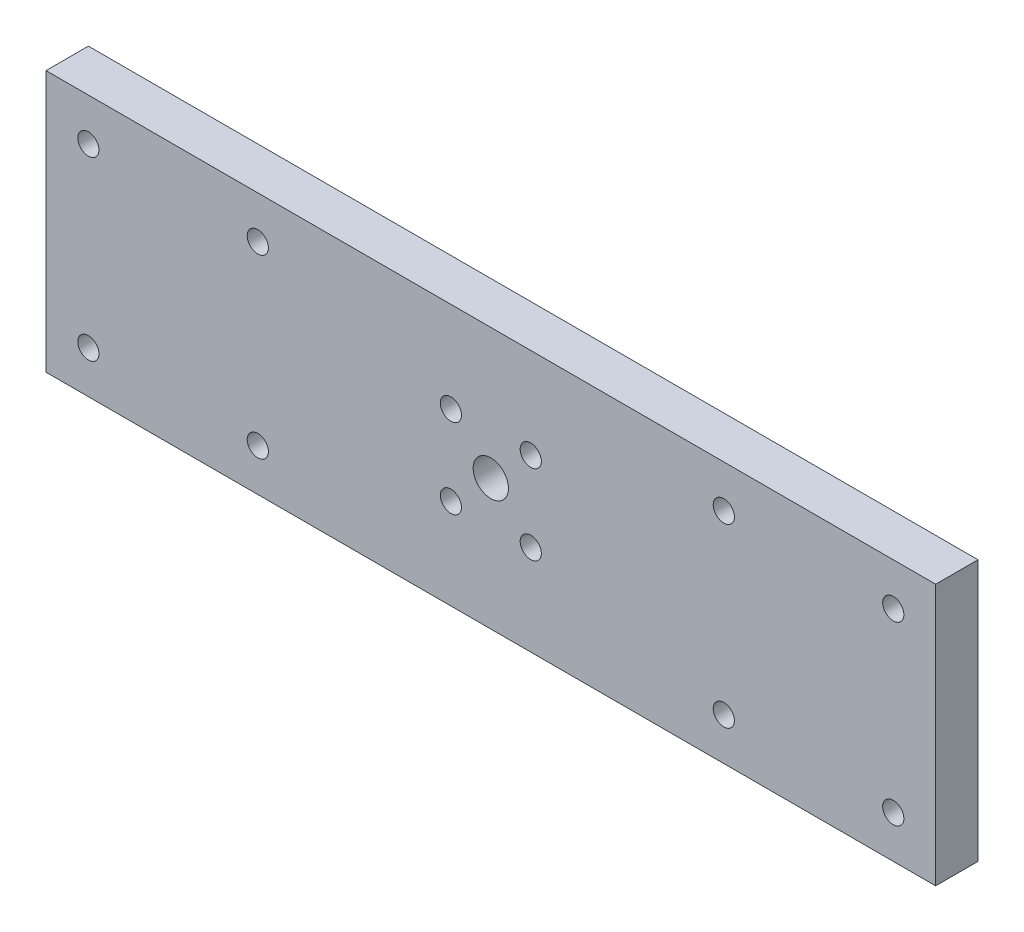
ISO-10303-21;
HEADER;
FILE_DESCRIPTION(('STEP AP214'),'2;1');
FILE_NAME('part.step','',(''),(''),'','','');
FILE_SCHEMA(('AUTOMOTIVE_DESIGN { 1 0 10303 214 1 1 1 1 }'));
ENDSEC;
DATA;
#1=APPLICATION_CONTEXT('core data for automotive mechanical design processes');
#2=APPLICATION_PROTOCOL_DEFINITION('international standard','automotive_design',2000,#1);
#3=PRODUCT_CONTEXT('',#1,'mechanical');
#4=PRODUCT('Part','Part','',(#3));
#5=PRODUCT_RELATED_PRODUCT_CATEGORY('part','',(#4));
#6=PRODUCT_DEFINITION_FORMATION('','',#4);
#7=PRODUCT_DEFINITION_CONTEXT('part definition',#1,'design');
#8=PRODUCT_DEFINITION('design','',#6,#7);
#9=PRODUCT_DEFINITION_SHAPE('','',#8);
#10=(LENGTH_UNIT() NAMED_UNIT(*) SI_UNIT(.MILLI.,.METRE.));
#11=(NAMED_UNIT(*) PLANE_ANGLE_UNIT() SI_UNIT($,.RADIAN.));
#12=(NAMED_UNIT(*) SI_UNIT($,.STERADIAN.) SOLID_ANGLE_UNIT());
#13=UNCERTAINTY_MEASURE_WITH_UNIT(LENGTH_MEASURE(1.E-05),#10,'distance_accuracy_value','');
#14=(GEOMETRIC_REPRESENTATION_CONTEXT(3) GLOBAL_UNCERTAINTY_ASSIGNED_CONTEXT((#13)) GLOBAL_UNIT_ASSIGNED_CONTEXT((#10,
#11,#12)) REPRESENTATION_CONTEXT('',''));
#15=CARTESIAN_POINT('',(0.,0.,0.));
#16=DIRECTION('',(0.,0.,1.));
#17=DIRECTION('',(1.,0.,0.));
#18=AXIS2_PLACEMENT_3D('',#15,#16,#17);
#19=CARTESIAN_POINT('',(63.,0.,6.));
#20=DIRECTION('',(1.,0.,0.));
#21=DIRECTION('',(0.,0.,-1.));
#22=AXIS2_PLACEMENT_3D('',#19,#20,#21);
#23=PLANE('',#22);
#24=DIRECTION('',(0.,-1.,0.));
#25=VECTOR('',#24,1.);
#26=CARTESIAN_POINT('',(63.,0.,0.));
#27=LINE('',#26,#25);
#28=CARTESIAN_POINT('',(63.,18.5,0.));
#29=VERTEX_POINT('',#28);
#30=CARTESIAN_POINT('',(63.,-18.5,0.));
#31=VERTEX_POINT('',#30);
#32=EDGE_CURVE('E146',#29,#31,#27,.T.);
#33=ORIENTED_EDGE('',*,*,#32,.F.);
#34=DIRECTION('',(0.,0.,-1.));
#35=VECTOR('',#34,1.);
#36=CARTESIAN_POINT('',(63.,18.5,6.));
#37=LINE('',#36,#35);
#38=CARTESIAN_POINT('',(63.,18.5,6.));
#39=VERTEX_POINT('',#38);
#40=EDGE_CURVE('E11',#39,#29,#37,.T.);
#41=ORIENTED_EDGE('',*,*,#40,.F.);
#42=DIRECTION('',(0.,-1.,0.));
#43=VECTOR('',#42,1.);
#44=CARTESIAN_POINT('',(63.,0.,6.));
#45=LINE('',#44,#43);
#46=CARTESIAN_POINT('',(63.,-18.5,6.));
#47=VERTEX_POINT('',#46);
#48=EDGE_CURVE('E100',#39,#47,#45,.T.);
#49=ORIENTED_EDGE('',*,*,#48,.T.);
#50=DIRECTION('',(0.,0.,-1.));
#51=VECTOR('',#50,1.);
#52=CARTESIAN_POINT('',(63.,-18.5,6.));
#53=LINE('',#52,#51);
#54=EDGE_CURVE('E78',#47,#31,#53,.T.);
#55=ORIENTED_EDGE('',*,*,#54,.T.);
#56=EDGE_LOOP('',(#33,#41,#49,#55));
#57=FACE_BOUND('',#56,.T.);
#58=ADVANCED_FACE('F38',(#57),#23,.T.);
#59=CARTESIAN_POINT('',(0.,18.5,6.));
#60=DIRECTION('',(0.,1.,0.));
#61=DIRECTION('',(0.,0.,1.));
#62=AXIS2_PLACEMENT_3D('',#59,#60,#61);
#63=PLANE('',#62);
#64=DIRECTION('',(1.,0.,0.));
#65=VECTOR('',#64,1.);
#66=CARTESIAN_POINT('',(0.,18.5,0.));
#67=LINE('',#66,#65);
#68=CARTESIAN_POINT('',(-63.,18.5,0.));
#69=VERTEX_POINT('',#68);
#70=EDGE_CURVE('E90',#69,#29,#67,.T.);
#71=ORIENTED_EDGE('',*,*,#70,.F.);
#72=DIRECTION('',(0.,0.,-1.));
#73=VECTOR('',#72,1.);
#74=CARTESIAN_POINT('',(-63.,18.5,6.));
#75=LINE('',#74,#73);
#76=CARTESIAN_POINT('',(-63.,18.5,6.));
#77=VERTEX_POINT('',#76);
#78=EDGE_CURVE('E47',#77,#69,#75,.T.);
#79=ORIENTED_EDGE('',*,*,#78,.F.);
#80=DIRECTION('',(1.,0.,0.));
#81=VECTOR('',#80,1.);
#82=CARTESIAN_POINT('',(0.,18.5,6.));
#83=LINE('',#82,#81);
#84=EDGE_CURVE('E88',#77,#39,#83,.T.);
#85=ORIENTED_EDGE('',*,*,#84,.T.);
#86=ORIENTED_EDGE('',*,*,#40,.T.);
#87=EDGE_LOOP('',(#71,#79,#85,#86));
#88=FACE_BOUND('',#87,.T.);
#89=ADVANCED_FACE('F86',(#88),#63,.T.);
#90=CARTESIAN_POINT('',(-63.,0.,6.));
#91=DIRECTION('',(1.,0.,0.));
#92=DIRECTION('',(0.,0.,-1.));
#93=AXIS2_PLACEMENT_3D('',#90,#91,#92);
#94=PLANE('',#93);
#95=DIRECTION('',(0.,-1.,0.));
#96=VECTOR('',#95,1.);
#97=CARTESIAN_POINT('',(-63.,0.,0.));
#98=LINE('',#97,#96);
#99=CARTESIAN_POINT('',(-63.,-18.5,0.));
#100=VERTEX_POINT('',#99);
#101=EDGE_CURVE('E149',#69,#100,#98,.T.);
#102=ORIENTED_EDGE('',*,*,#101,.T.);
#103=DIRECTION('',(0.,0.,-1.));
#104=VECTOR('',#103,1.);
#105=CARTESIAN_POINT('',(-63.,-18.5,6.));
#106=LINE('',#105,#104);
#107=CARTESIAN_POINT('',(-63.,-18.5,6.));
#108=VERTEX_POINT('',#107);
#109=EDGE_CURVE('E93',#108,#100,#106,.T.);
#110=ORIENTED_EDGE('',*,*,#109,.F.);
#111=DIRECTION('',(0.,-1.,0.));
#112=VECTOR('',#111,1.);
#113=CARTESIAN_POINT('',(-63.,0.,6.));
#114=LINE('',#113,#112);
#115=EDGE_CURVE('E95',#77,#108,#114,.T.);
#116=ORIENTED_EDGE('',*,*,#115,.F.);
#117=ORIENTED_EDGE('',*,*,#78,.T.);
#118=EDGE_LOOP('',(#102,#110,#116,#117));
#119=FACE_BOUND('',#118,.T.);
#120=ADVANCED_FACE('F96',(#119),#94,.F.);
#121=CARTESIAN_POINT('',(5.65685424949239,5.65685424949238,6.));
#122=DIRECTION('',(0.,0.,-1.));
#123=DIRECTION('',(-1.,0.,0.));
#124=AXIS2_PLACEMENT_3D('',#121,#122,#123);
#125=CYLINDRICAL_SURFACE('',#124,1.5);
#126=CARTESIAN_POINT('',(5.65685424949239,5.65685424949238,6.));
#127=DIRECTION('',(0.,0.,1.));
#128=DIRECTION('',(1.,0.,0.));
#129=AXIS2_PLACEMENT_3D('',#126,#127,#128);
#130=CIRCLE('',#129,1.5);
#131=CARTESIAN_POINT('',(7.15685424949239,5.65685424949238,6.));
#132=VERTEX_POINT('',#131);
#133=EDGE_CURVE('E107',#132,#132,#130,.T.);
#134=ORIENTED_EDGE('',*,*,#133,.T.);
#135=EDGE_LOOP('',(#134));
#136=FACE_BOUND('',#135,.T.);
#137=CARTESIAN_POINT('',(5.65685424949239,5.65685424949238,0.));
#138=DIRECTION('',(0.,0.,1.));
#139=DIRECTION('',(1.,0.,0.));
#140=AXIS2_PLACEMENT_3D('',#137,#138,#139);
#141=CIRCLE('',#140,1.5);
#142=CARTESIAN_POINT('',(7.15685424949239,5.65685424949238,0.));
#143=VERTEX_POINT('',#142);
#144=EDGE_CURVE('E152',#143,#143,#141,.T.);
#145=ORIENTED_EDGE('',*,*,#144,.F.);
#146=EDGE_LOOP('',(#145));
#147=FACE_BOUND('',#146,.T.);
#148=ADVANCED_FACE('F260',(#136,#147),#125,.F.);
#149=CARTESIAN_POINT('',(0.,-18.5,6.));
#150=DIRECTION('',(0.,1.,0.));
#151=DIRECTION('',(0.,0.,1.));
#152=AXIS2_PLACEMENT_3D('',#149,#150,#151);
#153=PLANE('',#152);
#154=DIRECTION('',(1.,0.,0.));
#155=VECTOR('',#154,1.);
#156=CARTESIAN_POINT('',(0.,-18.5,0.));
#157=LINE('',#156,#155);
#158=EDGE_CURVE('E71',#100,#31,#157,.T.);
#159=ORIENTED_EDGE('',*,*,#158,.T.);
#160=ORIENTED_EDGE('',*,*,#54,.F.);
#161=DIRECTION('',(1.,0.,0.));
#162=VECTOR('',#161,1.);
#163=CARTESIAN_POINT('',(0.,-18.5,6.));
#164=LINE('',#163,#162);
#165=EDGE_CURVE('E55',#108,#47,#164,.T.);
#166=ORIENTED_EDGE('',*,*,#165,.F.);
#167=ORIENTED_EDGE('',*,*,#109,.T.);
#168=EDGE_LOOP('',(#159,#160,#166,#167));
#169=FACE_BOUND('',#168,.T.);
#170=ADVANCED_FACE('F161',(#169),#153,.F.);
#171=CARTESIAN_POINT('',(-57.,12.5,6.));
#172=DIRECTION('',(0.,0.,-1.));
#173=DIRECTION('',(-1.,0.,0.));
#174=AXIS2_PLACEMENT_3D('',#171,#172,#173);
#175=CYLINDRICAL_SURFACE('',#174,1.5);
#176=CARTESIAN_POINT('',(-57.,12.5,6.));
#177=DIRECTION('',(0.,0.,1.));
#178=DIRECTION('',(1.,0.,0.));
#179=AXIS2_PLACEMENT_3D('',#176,#177,#178);
#180=CIRCLE('',#179,1.5);
#181=CARTESIAN_POINT('',(-55.5,12.5,6.));
#182=VERTEX_POINT('',#181);
#183=EDGE_CURVE('E102',#182,#182,#180,.T.);
#184=ORIENTED_EDGE('',*,*,#183,.T.);
#185=EDGE_LOOP('',(#184));
#186=FACE_BOUND('',#185,.T.);
#187=CARTESIAN_POINT('',(-57.,12.5,0.));
#188=DIRECTION('',(0.,0.,1.));
#189=DIRECTION('',(1.,0.,0.));
#190=AXIS2_PLACEMENT_3D('',#187,#188,#189);
#191=CIRCLE('',#190,1.5);
#192=CARTESIAN_POINT('',(-55.5,12.5,0.));
#193=VERTEX_POINT('',#192);
#194=EDGE_CURVE('E143',#193,#193,#191,.T.);
#195=ORIENTED_EDGE('',*,*,#194,.F.);
#196=EDGE_LOOP('',(#195));
#197=FACE_BOUND('',#196,.T.);
#198=ADVANCED_FACE('F172',(#186,#197),#175,.F.);
#199=CARTESIAN_POINT('',(33.,12.5,6.));
#200=DIRECTION('',(0.,0.,-1.));
#201=DIRECTION('',(-1.,0.,0.));
#202=AXIS2_PLACEMENT_3D('',#199,#200,#201);
#203=CYLINDRICAL_SURFACE('',#202,1.5);
#204=CARTESIAN_POINT('',(33.,12.5,6.));
#205=DIRECTION('',(0.,0.,1.));
#206=DIRECTION('',(1.,0.,0.));
#207=AXIS2_PLACEMENT_3D('',#204,#205,#206);
#208=CIRCLE('',#207,1.5);
#209=CARTESIAN_POINT('',(34.5,12.5,6.));
#210=VERTEX_POINT('',#209);
#211=EDGE_CURVE('E443',#210,#210,#208,.T.);
#212=ORIENTED_EDGE('',*,*,#211,.T.);
#213=EDGE_LOOP('',(#212));
#214=FACE_BOUND('',#213,.T.);
#215=CARTESIAN_POINT('',(33.,12.5,0.));
#216=DIRECTION('',(0.,0.,1.));
#217=DIRECTION('',(1.,0.,0.));
#218=AXIS2_PLACEMENT_3D('',#215,#216,#217);
#219=CIRCLE('',#218,1.5);
#220=CARTESIAN_POINT('',(34.5,12.5,0.));
#221=VERTEX_POINT('',#220);
#222=EDGE_CURVE('E140',#221,#221,#219,.T.);
#223=ORIENTED_EDGE('',*,*,#222,.F.);
#224=EDGE_LOOP('',(#223));
#225=FACE_BOUND('',#224,.T.);
#226=ADVANCED_FACE('F175',(#214,#225),#203,.F.);
#227=CARTESIAN_POINT('',(-33.,12.5,6.));
#228=DIRECTION('',(0.,0.,-1.));
#229=DIRECTION('',(-1.,0.,0.));
#230=AXIS2_PLACEMENT_3D('',#227,#228,#229);
#231=CYLINDRICAL_SURFACE('',#230,1.5);
#232=CARTESIAN_POINT('',(-33.,12.5,6.));
#233=DIRECTION('',(0.,0.,1.));
#234=DIRECTION('',(1.,0.,0.));
#235=AXIS2_PLACEMENT_3D('',#232,#233,#234);
#236=CIRCLE('',#235,1.5);
#237=CARTESIAN_POINT('',(-31.5,12.5,6.));
#238=VERTEX_POINT('',#237);
#239=EDGE_CURVE('E439',#238,#238,#236,.T.);
#240=ORIENTED_EDGE('',*,*,#239,.T.);
#241=EDGE_LOOP('',(#240));
#242=FACE_BOUND('',#241,.T.);
#243=CARTESIAN_POINT('',(-33.,12.5,0.));
#244=DIRECTION('',(0.,0.,1.));
#245=DIRECTION('',(1.,0.,0.));
#246=AXIS2_PLACEMENT_3D('',#243,#244,#245);
#247=CIRCLE('',#246,1.5);
#248=CARTESIAN_POINT('',(-31.5,12.5,0.));
#249=VERTEX_POINT('',#248);
#250=EDGE_CURVE('E137',#249,#249,#247,.T.);
#251=ORIENTED_EDGE('',*,*,#250,.F.);
#252=EDGE_LOOP('',(#251));
#253=FACE_BOUND('',#252,.T.);
#254=ADVANCED_FACE('F179',(#242,#253),#231,.F.);
#255=CARTESIAN_POINT('',(-57.,-12.5,6.));
#256=DIRECTION('',(0.,0.,-1.));
#257=DIRECTION('',(-1.,0.,0.));
#258=AXIS2_PLACEMENT_3D('',#255,#256,#257);
#259=CYLINDRICAL_SURFACE('',#258,1.5);
#260=CARTESIAN_POINT('',(-57.,-12.5,6.));
#261=DIRECTION('',(0.,0.,1.));
#262=DIRECTION('',(1.,0.,0.));
#263=AXIS2_PLACEMENT_3D('',#260,#261,#262);
#264=CIRCLE('',#263,1.5);
#265=CARTESIAN_POINT('',(-55.5,-12.5,6.));
#266=VERTEX_POINT('',#265);
#267=EDGE_CURVE('E435',#266,#266,#264,.T.);
#268=ORIENTED_EDGE('',*,*,#267,.T.);
#269=EDGE_LOOP('',(#268));
#270=FACE_BOUND('',#269,.T.);
#271=CARTESIAN_POINT('',(-57.,-12.5,0.));
#272=DIRECTION('',(0.,0.,1.));
#273=DIRECTION('',(1.,0.,0.));
#274=AXIS2_PLACEMENT_3D('',#271,#272,#273);
#275=CIRCLE('',#274,1.5);
#276=CARTESIAN_POINT('',(-55.5,-12.5,0.));
#277=VERTEX_POINT('',#276);
#278=EDGE_CURVE('E134',#277,#277,#275,.T.);
#279=ORIENTED_EDGE('',*,*,#278,.F.);
#280=EDGE_LOOP('',(#279));
#281=FACE_BOUND('',#280,.T.);
#282=ADVANCED_FACE('F183',(#270,#281),#259,.F.);
#283=CARTESIAN_POINT('',(-33.,-12.5,6.));
#284=DIRECTION('',(0.,0.,-1.));
#285=DIRECTION('',(-1.,0.,0.));
#286=AXIS2_PLACEMENT_3D('',#283,#284,#285);
#287=CYLINDRICAL_SURFACE('',#286,1.5);
#288=CARTESIAN_POINT('',(-33.,-12.5,6.));
#289=DIRECTION('',(0.,0.,1.));
#290=DIRECTION('',(1.,0.,0.));
#291=AXIS2_PLACEMENT_3D('',#288,#289,#290);
#292=CIRCLE('',#291,1.5);
#293=CARTESIAN_POINT('',(-31.5,-12.5,6.));
#294=VERTEX_POINT('',#293);
#295=EDGE_CURVE('E431',#294,#294,#292,.T.);
#296=ORIENTED_EDGE('',*,*,#295,.T.);
#297=EDGE_LOOP('',(#296));
#298=FACE_BOUND('',#297,.T.);
#299=CARTESIAN_POINT('',(-33.,-12.5,0.));
#300=DIRECTION('',(0.,0.,1.));
#301=DIRECTION('',(1.,0.,0.));
#302=AXIS2_PLACEMENT_3D('',#299,#300,#301);
#303=CIRCLE('',#302,1.5);
#304=CARTESIAN_POINT('',(-31.5,-12.5,0.));
#305=VERTEX_POINT('',#304);
#306=EDGE_CURVE('E131',#305,#305,#303,.T.);
#307=ORIENTED_EDGE('',*,*,#306,.F.);
#308=EDGE_LOOP('',(#307));
#309=FACE_BOUND('',#308,.T.);
#310=ADVANCED_FACE('F187',(#298,#309),#287,.F.);
#311=CARTESIAN_POINT('',(57.,-12.5,6.));
#312=DIRECTION('',(0.,0.,-1.));
#313=DIRECTION('',(-1.,0.,0.));
#314=AXIS2_PLACEMENT_3D('',#311,#312,#313);
#315=CYLINDRICAL_SURFACE('',#314,1.5);
#316=CARTESIAN_POINT('',(57.,-12.5,6.));
#317=DIRECTION('',(0.,0.,1.));
#318=DIRECTION('',(1.,0.,0.));
#319=AXIS2_PLACEMENT_3D('',#316,#317,#318);
#320=CIRCLE('',#319,1.5);
#321=CARTESIAN_POINT('',(58.5,-12.5,6.));
#322=VERTEX_POINT('',#321);
#323=EDGE_CURVE('E427',#322,#322,#320,.T.);
#324=ORIENTED_EDGE('',*,*,#323,.T.);
#325=EDGE_LOOP('',(#324));
#326=FACE_BOUND('',#325,.T.);
#327=CARTESIAN_POINT('',(57.,-12.5,0.));
#328=DIRECTION('',(0.,0.,1.));
#329=DIRECTION('',(1.,0.,0.));
#330=AXIS2_PLACEMENT_3D('',#327,#328,#329);
#331=CIRCLE('',#330,1.5);
#332=CARTESIAN_POINT('',(58.5,-12.5,0.));
#333=VERTEX_POINT('',#332);
#334=EDGE_CURVE('E128',#333,#333,#331,.T.);
#335=ORIENTED_EDGE('',*,*,#334,.F.);
#336=EDGE_LOOP('',(#335));
#337=FACE_BOUND('',#336,.T.);
#338=ADVANCED_FACE('F191',(#326,#337),#315,.F.);
#339=CARTESIAN_POINT('',(57.,12.5,6.));
#340=DIRECTION('',(0.,0.,-1.));
#341=DIRECTION('',(-1.,0.,0.));
#342=AXIS2_PLACEMENT_3D('',#339,#340,#341);
#343=CYLINDRICAL_SURFACE('',#342,1.5);
#344=CARTESIAN_POINT('',(57.,12.5,6.));
#345=DIRECTION('',(0.,0.,1.));
#346=DIRECTION('',(1.,0.,0.));
#347=AXIS2_PLACEMENT_3D('',#344,#345,#346);
#348=CIRCLE('',#347,1.5);
#349=CARTESIAN_POINT('',(58.5,12.5,6.));
#350=VERTEX_POINT('',#349);
#351=EDGE_CURVE('E423',#350,#350,#348,.T.);
#352=ORIENTED_EDGE('',*,*,#351,.T.);
#353=EDGE_LOOP('',(#352));
#354=FACE_BOUND('',#353,.T.);
#355=CARTESIAN_POINT('',(57.,12.5,0.));
#356=DIRECTION('',(0.,0.,1.));
#357=DIRECTION('',(1.,0.,0.));
#358=AXIS2_PLACEMENT_3D('',#355,#356,#357);
#359=CIRCLE('',#358,1.5);
#360=CARTESIAN_POINT('',(58.5,12.5,0.));
#361=VERTEX_POINT('',#360);
#362=EDGE_CURVE('E125',#361,#361,#359,.T.);
#363=ORIENTED_EDGE('',*,*,#362,.F.);
#364=EDGE_LOOP('',(#363));
#365=FACE_BOUND('',#364,.T.);
#366=ADVANCED_FACE('F195',(#354,#365),#343,.F.);
#367=CARTESIAN_POINT('',(33.,-12.5,6.));
#368=DIRECTION('',(0.,0.,-1.));
#369=DIRECTION('',(-1.,0.,0.));
#370=AXIS2_PLACEMENT_3D('',#367,#368,#369);
#371=CYLINDRICAL_SURFACE('',#370,1.5);
#372=CARTESIAN_POINT('',(33.,-12.5,6.));
#373=DIRECTION('',(0.,0.,1.));
#374=DIRECTION('',(1.,0.,0.));
#375=AXIS2_PLACEMENT_3D('',#372,#373,#374);
#376=CIRCLE('',#375,1.5);
#377=CARTESIAN_POINT('',(34.5,-12.5,6.));
#378=VERTEX_POINT('',#377);
#379=EDGE_CURVE('E419',#378,#378,#376,.T.);
#380=ORIENTED_EDGE('',*,*,#379,.T.);
#381=EDGE_LOOP('',(#380));
#382=FACE_BOUND('',#381,.T.);
#383=CARTESIAN_POINT('',(33.,-12.5,0.));
#384=DIRECTION('',(0.,0.,1.));
#385=DIRECTION('',(1.,0.,0.));
#386=AXIS2_PLACEMENT_3D('',#383,#384,#385);
#387=CIRCLE('',#386,1.5);
#388=CARTESIAN_POINT('',(34.5,-12.5,0.));
#389=VERTEX_POINT('',#388);
#390=EDGE_CURVE('E122',#389,#389,#387,.T.);
#391=ORIENTED_EDGE('',*,*,#390,.F.);
#392=EDGE_LOOP('',(#391));
#393=FACE_BOUND('',#392,.T.);
#394=ADVANCED_FACE('F199',(#382,#393),#371,.F.);
#395=CARTESIAN_POINT('',(-5.65685424949237,5.65685424949238,6.));
#396=DIRECTION('',(0.,0.,-1.));
#397=DIRECTION('',(-1.,0.,0.));
#398=AXIS2_PLACEMENT_3D('',#395,#396,#397);
#399=CYLINDRICAL_SURFACE('',#398,1.5);
#400=CARTESIAN_POINT('',(-5.65685424949237,5.65685424949238,6.));
#401=DIRECTION('',(0.,0.,1.));
#402=DIRECTION('',(1.,0.,0.));
#403=AXIS2_PLACEMENT_3D('',#400,#401,#402);
#404=CIRCLE('',#403,1.5);
#405=CARTESIAN_POINT('',(-4.15685424949237,5.65685424949238,6.));
#406=VERTEX_POINT('',#405);
#407=EDGE_CURVE('E415',#406,#406,#404,.T.);
#408=ORIENTED_EDGE('',*,*,#407,.T.);
#409=EDGE_LOOP('',(#408));
#410=FACE_BOUND('',#409,.T.);
#411=CARTESIAN_POINT('',(-5.65685424949237,5.65685424949238,0.));
#412=DIRECTION('',(0.,0.,1.));
#413=DIRECTION('',(1.,0.,0.));
#414=AXIS2_PLACEMENT_3D('',#411,#412,#413);
#415=CIRCLE('',#414,1.5);
#416=CARTESIAN_POINT('',(-4.15685424949237,5.65685424949238,0.));
#417=VERTEX_POINT('',#416);
#418=EDGE_CURVE('E119',#417,#417,#415,.T.);
#419=ORIENTED_EDGE('',*,*,#418,.F.);
#420=EDGE_LOOP('',(#419));
#421=FACE_BOUND('',#420,.T.);
#422=ADVANCED_FACE('F203',(#410,#421),#399,.F.);
#423=CARTESIAN_POINT('',(-5.65685424949237,-5.65685424949238,6.));
#424=DIRECTION('',(0.,0.,-1.));
#425=DIRECTION('',(-1.,0.,0.));
#426=AXIS2_PLACEMENT_3D('',#423,#424,#425);
#427=CYLINDRICAL_SURFACE('',#426,1.5);
#428=CARTESIAN_POINT('',(-5.65685424949237,-5.65685424949238,6.));
#429=DIRECTION('',(0.,0.,1.));
#430=DIRECTION('',(1.,0.,0.));
#431=AXIS2_PLACEMENT_3D('',#428,#429,#430);
#432=CIRCLE('',#431,1.5);
#433=CARTESIAN_POINT('',(-4.15685424949237,-5.65685424949238,6.));
#434=VERTEX_POINT('',#433);
#435=EDGE_CURVE('E218',#434,#434,#432,.T.);
#436=ORIENTED_EDGE('',*,*,#435,.T.);
#437=EDGE_LOOP('',(#436));
#438=FACE_BOUND('',#437,.T.);
#439=CARTESIAN_POINT('',(-5.65685424949237,-5.65685424949238,0.));
#440=DIRECTION('',(0.,0.,1.));
#441=DIRECTION('',(1.,0.,0.));
#442=AXIS2_PLACEMENT_3D('',#439,#440,#441);
#443=CIRCLE('',#442,1.5);
#444=CARTESIAN_POINT('',(-4.15685424949237,-5.65685424949238,0.));
#445=VERTEX_POINT('',#444);
#446=EDGE_CURVE('E116',#445,#445,#443,.T.);
#447=ORIENTED_EDGE('',*,*,#446,.F.);
#448=EDGE_LOOP('',(#447));
#449=FACE_BOUND('',#448,.T.);
#450=ADVANCED_FACE('F206',(#438,#449),#427,.F.);
#451=CARTESIAN_POINT('',(5.65685424949239,-5.65685424949238,6.));
#452=DIRECTION('',(0.,0.,-1.));
#453=DIRECTION('',(-1.,0.,0.));
#454=AXIS2_PLACEMENT_3D('',#451,#452,#453);
#455=CYLINDRICAL_SURFACE('',#454,1.5);
#456=CARTESIAN_POINT('',(5.65685424949239,-5.65685424949238,6.));
#457=DIRECTION('',(0.,0.,1.));
#458=DIRECTION('',(1.,0.,0.));
#459=AXIS2_PLACEMENT_3D('',#456,#457,#458);
#460=CIRCLE('',#459,1.5);
#461=CARTESIAN_POINT('',(7.15685424949239,-5.65685424949238,6.));
#462=VERTEX_POINT('',#461);
#463=EDGE_CURVE('E158',#462,#462,#460,.T.);
#464=ORIENTED_EDGE('',*,*,#463,.T.);
#465=EDGE_LOOP('',(#464));
#466=FACE_BOUND('',#465,.T.);
#467=CARTESIAN_POINT('',(5.65685424949239,-5.65685424949238,0.));
#468=DIRECTION('',(0.,0.,1.));
#469=DIRECTION('',(1.,0.,0.));
#470=AXIS2_PLACEMENT_3D('',#467,#468,#469);
#471=CIRCLE('',#470,1.5);
#472=CARTESIAN_POINT('',(7.15685424949239,-5.65685424949238,0.));
#473=VERTEX_POINT('',#472);
#474=EDGE_CURVE('E113',#473,#473,#471,.T.);
#475=ORIENTED_EDGE('',*,*,#474,.F.);
#476=EDGE_LOOP('',(#475));
#477=FACE_BOUND('',#476,.T.);
#478=ADVANCED_FACE('F40',(#466,#477),#455,.F.);
#479=CARTESIAN_POINT('',(0.,0.,6.));
#480=DIRECTION('',(0.,0.,-1.));
#481=DIRECTION('',(-1.,0.,0.));
#482=AXIS2_PLACEMENT_3D('',#479,#480,#481);
#483=CYLINDRICAL_SURFACE('',#482,2.5);
#484=CARTESIAN_POINT('',(0.,0.,6.));
#485=DIRECTION('',(0.,0.,1.));
#486=DIRECTION('',(1.,0.,0.));
#487=AXIS2_PLACEMENT_3D('',#484,#485,#486);
#488=CIRCLE('',#487,2.5);
#489=CARTESIAN_POINT('',(2.50000000000003,0.,6.));
#490=VERTEX_POINT('',#489);
#491=EDGE_CURVE('E110',#490,#490,#488,.T.);
#492=ORIENTED_EDGE('',*,*,#491,.T.);
#493=EDGE_LOOP('',(#492));
#494=FACE_BOUND('',#493,.T.);
#495=CARTESIAN_POINT('',(0.,0.,0.));
#496=DIRECTION('',(0.,0.,1.));
#497=DIRECTION('',(1.,0.,0.));
#498=AXIS2_PLACEMENT_3D('',#495,#496,#497);
#499=CIRCLE('',#498,2.5);
#500=CARTESIAN_POINT('',(2.50000000000003,0.,0.));
#501=VERTEX_POINT('',#500);
#502=EDGE_CURVE('E155',#501,#501,#499,.T.);
#503=ORIENTED_EDGE('',*,*,#502,.F.);
#504=EDGE_LOOP('',(#503));
#505=FACE_BOUND('',#504,.T.);
#506=ADVANCED_FACE('F213',(#494,#505),#483,.F.);
#507=CARTESIAN_POINT('',(0.,0.,6.));
#508=DIRECTION('',(0.,0.,1.));
#509=DIRECTION('',(1.,0.,0.));
#510=AXIS2_PLACEMENT_3D('',#507,#508,#509);
#511=PLANE('',#510);
#512=ORIENTED_EDGE('',*,*,#463,.F.);
#513=EDGE_LOOP('',(#512));
#514=FACE_BOUND('',#513,.T.);
#515=ORIENTED_EDGE('',*,*,#435,.F.);
#516=EDGE_LOOP('',(#515));
#517=FACE_BOUND('',#516,.T.);
#518=ORIENTED_EDGE('',*,*,#407,.F.);
#519=EDGE_LOOP('',(#518));
#520=FACE_BOUND('',#519,.T.);
#521=ORIENTED_EDGE('',*,*,#379,.F.);
#522=EDGE_LOOP('',(#521));
#523=FACE_BOUND('',#522,.T.);
#524=ORIENTED_EDGE('',*,*,#351,.F.);
#525=EDGE_LOOP('',(#524));
#526=FACE_BOUND('',#525,.T.);
#527=ORIENTED_EDGE('',*,*,#323,.F.);
#528=EDGE_LOOP('',(#527));
#529=FACE_BOUND('',#528,.T.);
#530=ORIENTED_EDGE('',*,*,#295,.F.);
#531=EDGE_LOOP('',(#530));
#532=FACE_BOUND('',#531,.T.);
#533=ORIENTED_EDGE('',*,*,#267,.F.);
#534=EDGE_LOOP('',(#533));
#535=FACE_BOUND('',#534,.T.);
#536=ORIENTED_EDGE('',*,*,#239,.F.);
#537=EDGE_LOOP('',(#536));
#538=FACE_BOUND('',#537,.T.);
#539=ORIENTED_EDGE('',*,*,#211,.F.);
#540=EDGE_LOOP('',(#539));
#541=FACE_BOUND('',#540,.T.);
#542=ORIENTED_EDGE('',*,*,#183,.F.);
#543=EDGE_LOOP('',(#542));
#544=FACE_BOUND('',#543,.T.);
#545=ORIENTED_EDGE('',*,*,#48,.F.);
#546=ORIENTED_EDGE('',*,*,#84,.F.);
#547=ORIENTED_EDGE('',*,*,#115,.T.);
#548=ORIENTED_EDGE('',*,*,#165,.T.);
#549=EDGE_LOOP('',(#545,#546,#547,#548));
#550=FACE_BOUND('',#549,.T.);
#551=ORIENTED_EDGE('',*,*,#133,.F.);
#552=EDGE_LOOP('',(#551));
#553=FACE_BOUND('',#552,.T.);
#554=ORIENTED_EDGE('',*,*,#491,.F.);
#555=EDGE_LOOP('',(#554));
#556=FACE_BOUND('',#555,.T.);
#557=ADVANCED_FACE('F98',(#514,#517,#520,#523,#526,#529,#532,#535,#538,#541,#544,#550,#553,
#556),#511,.T.);
#558=CARTESIAN_POINT('',(0.,0.,0.));
#559=DIRECTION('',(0.,0.,1.));
#560=DIRECTION('',(1.,0.,0.));
#561=AXIS2_PLACEMENT_3D('',#558,#559,#560);
#562=PLANE('',#561);
#563=ORIENTED_EDGE('',*,*,#474,.T.);
#564=EDGE_LOOP('',(#563));
#565=FACE_BOUND('',#564,.T.);
#566=ORIENTED_EDGE('',*,*,#446,.T.);
#567=EDGE_LOOP('',(#566));
#568=FACE_BOUND('',#567,.T.);
#569=ORIENTED_EDGE('',*,*,#418,.T.);
#570=EDGE_LOOP('',(#569));
#571=FACE_BOUND('',#570,.T.);
#572=ORIENTED_EDGE('',*,*,#390,.T.);
#573=EDGE_LOOP('',(#572));
#574=FACE_BOUND('',#573,.T.);
#575=ORIENTED_EDGE('',*,*,#362,.T.);
#576=EDGE_LOOP('',(#575));
#577=FACE_BOUND('',#576,.T.);
#578=ORIENTED_EDGE('',*,*,#334,.T.);
#579=EDGE_LOOP('',(#578));
#580=FACE_BOUND('',#579,.T.);
#581=ORIENTED_EDGE('',*,*,#306,.T.);
#582=EDGE_LOOP('',(#581));
#583=FACE_BOUND('',#582,.T.);
#584=ORIENTED_EDGE('',*,*,#278,.T.);
#585=EDGE_LOOP('',(#584));
#586=FACE_BOUND('',#585,.T.);
#587=ORIENTED_EDGE('',*,*,#250,.T.);
#588=EDGE_LOOP('',(#587));
#589=FACE_BOUND('',#588,.T.);
#590=ORIENTED_EDGE('',*,*,#222,.T.);
#591=EDGE_LOOP('',(#590));
#592=FACE_BOUND('',#591,.T.);
#593=ORIENTED_EDGE('',*,*,#194,.T.);
#594=EDGE_LOOP('',(#593));
#595=FACE_BOUND('',#594,.T.);
#596=ORIENTED_EDGE('',*,*,#32,.T.);
#597=ORIENTED_EDGE('',*,*,#158,.F.);
#598=ORIENTED_EDGE('',*,*,#101,.F.);
#599=ORIENTED_EDGE('',*,*,#70,.T.);
#600=EDGE_LOOP('',(#596,#597,#598,#599));
#601=FACE_BOUND('',#600,.T.);
#602=ORIENTED_EDGE('',*,*,#144,.T.);
#603=EDGE_LOOP('',(#602));
#604=FACE_BOUND('',#603,.T.);
#605=ORIENTED_EDGE('',*,*,#502,.T.);
#606=EDGE_LOOP('',(#605));
#607=FACE_BOUND('',#606,.T.);
#608=ADVANCED_FACE('F162',(#565,#568,#571,#574,#577,#580,#583,#586,#589,#592,#595,#601,#604,
#607),#562,.F.);
#609=CLOSED_SHELL('',(#58,#89,#120,#148,#170,#198,#226,#254,#282,#310,#338,#366,#394,#422,#450,
#478,#506,#557,#608));
#610=MANIFOLD_SOLID_BREP('B2',#609);
#611=ADVANCED_BREP_SHAPE_REPRESENTATION('',(#18,#610),#14);
#612=SHAPE_DEFINITION_REPRESENTATION(#9,#611);
ENDSEC;
END-ISO-10303-21;
